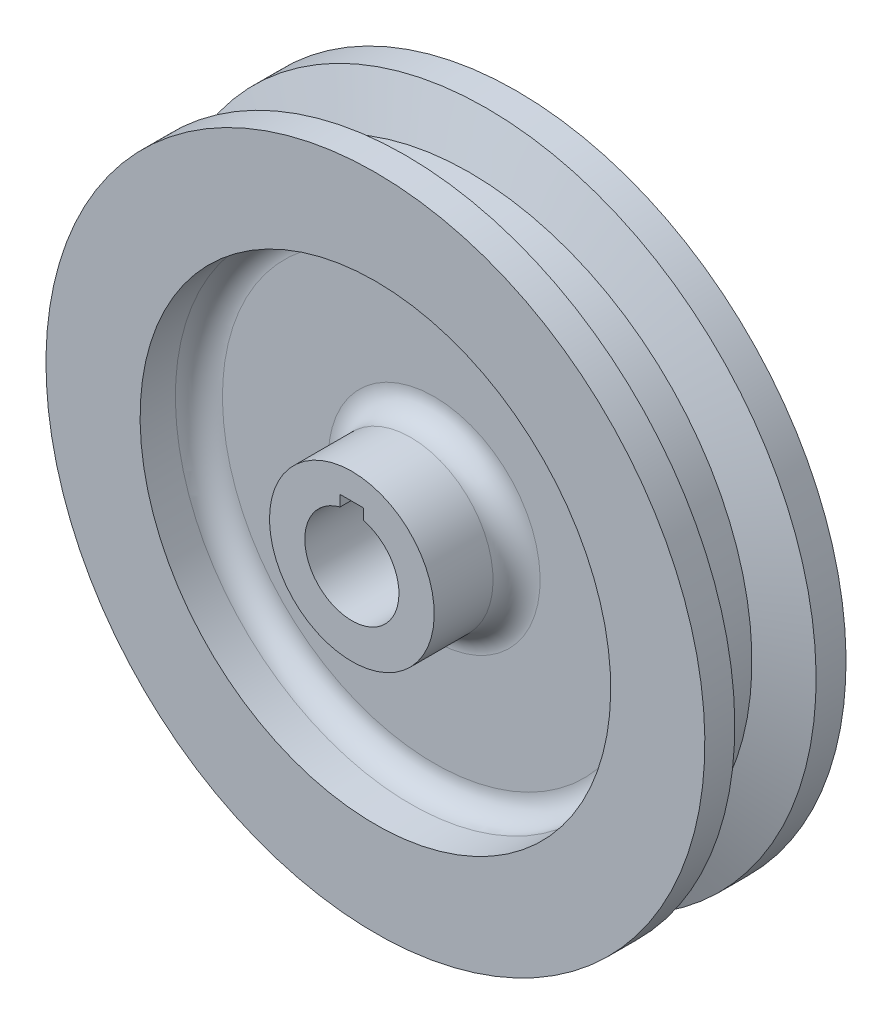
ISO-10303-21;
HEADER;
FILE_DESCRIPTION(('STEP AP214'),'2;1');
FILE_NAME('part.step','',(''),(''),'','','');
FILE_SCHEMA(('AUTOMOTIVE_DESIGN { 1 0 10303 214 1 1 1 1 }'));
ENDSEC;
DATA;
#1=APPLICATION_CONTEXT('core data for automotive mechanical design processes');
#2=APPLICATION_PROTOCOL_DEFINITION('international standard','automotive_design',2000,#1);
#3=PRODUCT_CONTEXT('',#1,'mechanical');
#4=PRODUCT('Part','Part','',(#3));
#5=PRODUCT_RELATED_PRODUCT_CATEGORY('part','',(#4));
#6=PRODUCT_DEFINITION_FORMATION('','',#4);
#7=PRODUCT_DEFINITION_CONTEXT('part definition',#1,'design');
#8=PRODUCT_DEFINITION('design','',#6,#7);
#9=PRODUCT_DEFINITION_SHAPE('','',#8);
#10=(LENGTH_UNIT() NAMED_UNIT(*) SI_UNIT(.MILLI.,.METRE.));
#11=(NAMED_UNIT(*) PLANE_ANGLE_UNIT() SI_UNIT($,.RADIAN.));
#12=(NAMED_UNIT(*) SI_UNIT($,.STERADIAN.) SOLID_ANGLE_UNIT());
#13=UNCERTAINTY_MEASURE_WITH_UNIT(LENGTH_MEASURE(1.E-05),#10,'distance_accuracy_value','');
#14=(GEOMETRIC_REPRESENTATION_CONTEXT(3) GLOBAL_UNCERTAINTY_ASSIGNED_CONTEXT((#13)) GLOBAL_UNIT_ASSIGNED_CONTEXT((#10,
#11,#12)) REPRESENTATION_CONTEXT('',''));
#15=CARTESIAN_POINT('',(0.,0.,0.));
#16=DIRECTION('',(0.,0.,1.));
#17=DIRECTION('',(1.,0.,0.));
#18=AXIS2_PLACEMENT_3D('',#15,#16,#17);
#19=CARTESIAN_POINT('',(0.,22.225,-25.4));
#20=DIRECTION('',(0.,0.,-1.));
#21=DIRECTION('',(0.,1.,0.));
#22=AXIS2_PLACEMENT_3D('',#19,#20,#21);
#23=PLANE('',#22);
#24=DIRECTION('',(0.,-1.,0.));
#25=VECTOR('',#24,1.);
#26=CARTESIAN_POINT('',(-3.175,15.24,-25.4));
#27=LINE('',#26,#25);
#28=CARTESIAN_POINT('',(-3.175,15.24,-25.4));
#29=VERTEX_POINT('',#28);
#30=CARTESIAN_POINT('',(-3.175,12.2967221242086,-25.4));
#31=VERTEX_POINT('',#30);
#32=EDGE_CURVE('E104',#29,#31,#27,.T.);
#33=ORIENTED_EDGE('',*,*,#32,.T.);
#34=CARTESIAN_POINT('',(0.,0.,-25.4));
#35=DIRECTION('',(0.,0.,-1.));
#36=DIRECTION('',(0.,1.,0.));
#37=AXIS2_PLACEMENT_3D('',#34,#35,#36);
#38=CIRCLE('',#37,12.7);
#39=CARTESIAN_POINT('',(3.175,12.2967221242086,-25.4));
#40=VERTEX_POINT('',#39);
#41=EDGE_CURVE('E55',#40,#31,#38,.T.);
#42=ORIENTED_EDGE('',*,*,#41,.F.);
#43=DIRECTION('',(0.,1.,0.));
#44=VECTOR('',#43,1.);
#45=CARTESIAN_POINT('',(3.175,15.24,-25.4));
#46=LINE('',#45,#44);
#47=CARTESIAN_POINT('',(3.175,15.24,-25.4));
#48=VERTEX_POINT('',#47);
#49=EDGE_CURVE('E90',#40,#48,#46,.T.);
#50=ORIENTED_EDGE('',*,*,#49,.T.);
#51=DIRECTION('',(-1.,0.,0.));
#52=VECTOR('',#51,1.);
#53=CARTESIAN_POINT('',(-3.175,15.24,-25.4));
#54=LINE('',#53,#52);
#55=EDGE_CURVE('E95',#48,#29,#54,.T.);
#56=ORIENTED_EDGE('',*,*,#55,.T.);
#57=EDGE_LOOP('',(#33,#42,#50,#56));
#58=FACE_BOUND('',#57,.T.);
#59=CARTESIAN_POINT('',(0.,0.,-25.4));
#60=DIRECTION('',(0.,0.,-1.));
#61=DIRECTION('',(0.,1.,0.));
#62=AXIS2_PLACEMENT_3D('',#59,#60,#61);
#63=CIRCLE('',#62,22.225);
#64=CARTESIAN_POINT('',(0.,22.225,-25.4));
#65=VERTEX_POINT('',#64);
#66=EDGE_CURVE('E115',#65,#65,#63,.T.);
#67=ORIENTED_EDGE('',*,*,#66,.T.);
#68=EDGE_LOOP('',(#67));
#69=FACE_BOUND('',#68,.T.);
#70=ADVANCED_FACE('F48',(#58,#69),#23,.T.);
#71=CARTESIAN_POINT('',(0.,0.,0.));
#72=DIRECTION('',(0.,0.,-1.));
#73=DIRECTION('',(0.,1.,0.));
#74=AXIS2_PLACEMENT_3D('',#71,#72,#73);
#75=CYLINDRICAL_SURFACE('',#74,12.7);
#76=DIRECTION('',(0.,0.,-1.));
#77=VECTOR('',#76,1.);
#78=CARTESIAN_POINT('',(-3.175,12.2967221242086,0.));
#79=LINE('',#78,#77);
#80=CARTESIAN_POINT('',(-3.175,12.2967221242086,25.4));
#81=VERTEX_POINT('',#80);
#82=EDGE_CURVE('E69',#81,#31,#79,.T.);
#83=ORIENTED_EDGE('',*,*,#82,.F.);
#84=CARTESIAN_POINT('',(0.,0.,25.4));
#85=DIRECTION('',(0.,0.,-1.));
#86=DIRECTION('',(0.,1.,0.));
#87=AXIS2_PLACEMENT_3D('',#84,#85,#86);
#88=CIRCLE('',#87,12.7);
#89=CARTESIAN_POINT('',(3.175,12.2967221242086,25.4));
#90=VERTEX_POINT('',#89);
#91=EDGE_CURVE('E169',#90,#81,#88,.T.);
#92=ORIENTED_EDGE('',*,*,#91,.F.);
#93=DIRECTION('',(0.,0.,-1.));
#94=VECTOR('',#93,1.);
#95=CARTESIAN_POINT('',(3.175,12.2967221242086,0.));
#96=LINE('',#95,#94);
#97=EDGE_CURVE('E61',#40,#90,#96,.F.);
#98=ORIENTED_EDGE('',*,*,#97,.F.);
#99=ORIENTED_EDGE('',*,*,#41,.T.);
#100=EDGE_LOOP('',(#83,#92,#98,#99));
#101=FACE_BOUND('',#100,.T.);
#102=ADVANCED_FACE('F172',(#101),#75,.F.);
#103=CARTESIAN_POINT('',(0.,22.225,25.4));
#104=DIRECTION('',(0.,0.,1.));
#105=DIRECTION('',(0.,-1.,0.));
#106=AXIS2_PLACEMENT_3D('',#103,#104,#105);
#107=PLANE('',#106);
#108=DIRECTION('',(0.,-1.,0.));
#109=VECTOR('',#108,1.);
#110=CARTESIAN_POINT('',(-3.175,15.24,25.4));
#111=LINE('',#110,#109);
#112=CARTESIAN_POINT('',(-3.175,15.24,25.4));
#113=VERTEX_POINT('',#112);
#114=EDGE_CURVE('E109',#113,#81,#111,.T.);
#115=ORIENTED_EDGE('',*,*,#114,.F.);
#116=DIRECTION('',(-1.,0.,0.));
#117=VECTOR('',#116,1.);
#118=CARTESIAN_POINT('',(-3.175,15.24,25.4));
#119=LINE('',#118,#117);
#120=CARTESIAN_POINT('',(3.175,15.24,25.4));
#121=VERTEX_POINT('',#120);
#122=EDGE_CURVE('E106',#121,#113,#119,.T.);
#123=ORIENTED_EDGE('',*,*,#122,.F.);
#124=DIRECTION('',(0.,1.,0.));
#125=VECTOR('',#124,1.);
#126=CARTESIAN_POINT('',(3.175,22.225,25.4));
#127=LINE('',#126,#125);
#128=EDGE_CURVE('E13',#90,#121,#127,.T.);
#129=ORIENTED_EDGE('',*,*,#128,.F.);
#130=ORIENTED_EDGE('',*,*,#91,.T.);
#131=EDGE_LOOP('',(#115,#123,#129,#130));
#132=FACE_BOUND('',#131,.T.);
#133=CARTESIAN_POINT('',(0.,0.,25.4));
#134=DIRECTION('',(0.,0.,-1.));
#135=DIRECTION('',(0.,1.,0.));
#136=AXIS2_PLACEMENT_3D('',#133,#134,#135);
#137=CIRCLE('',#136,22.225);
#138=CARTESIAN_POINT('',(0.,22.225,25.4));
#139=VERTEX_POINT('',#138);
#140=EDGE_CURVE('E166',#139,#139,#137,.T.);
#141=ORIENTED_EDGE('',*,*,#140,.F.);
#142=EDGE_LOOP('',(#141));
#143=FACE_BOUND('',#142,.T.);
#144=ADVANCED_FACE('F176',(#132,#143),#107,.T.);
#145=CARTESIAN_POINT('',(0.,0.,0.));
#146=DIRECTION('',(0.,0.,-1.));
#147=DIRECTION('',(0.,1.,0.));
#148=AXIS2_PLACEMENT_3D('',#145,#146,#147);
#149=CYLINDRICAL_SURFACE('',#148,22.225);
#150=ORIENTED_EDGE('',*,*,#140,.T.);
#151=EDGE_LOOP('',(#150));
#152=FACE_BOUND('',#151,.T.);
#153=CARTESIAN_POINT('',(0.,0.,9.52500000000004));
#154=DIRECTION('',(0.,0.,-1.));
#155=DIRECTION('',(0.,1.,0.));
#156=AXIS2_PLACEMENT_3D('',#153,#154,#155);
#157=CIRCLE('',#156,22.225);
#158=CARTESIAN_POINT('',(0.,22.225,9.52500000000004));
#159=VERTEX_POINT('',#158);
#160=EDGE_CURVE('E163',#159,#159,#157,.T.);
#161=ORIENTED_EDGE('',*,*,#160,.F.);
#162=EDGE_LOOP('',(#161));
#163=FACE_BOUND('',#162,.T.);
#164=ADVANCED_FACE('F198',(#152,#163),#149,.T.);
#165=CARTESIAN_POINT('',(0.,0.,9.525));
#166=DIRECTION('',(0.,0.,-1.));
#167=DIRECTION('',(0.,1.,0.));
#168=AXIS2_PLACEMENT_3D('',#165,#166,#167);
#169=TOROIDAL_SURFACE('',#168,28.575,6.35);
#170=ORIENTED_EDGE('',*,*,#160,.T.);
#171=EDGE_LOOP('',(#170));
#172=FACE_BOUND('',#171,.T.);
#173=CARTESIAN_POINT('',(0.,0.,3.175));
#174=DIRECTION('',(0.,0.,-1.));
#175=DIRECTION('',(0.,1.,0.));
#176=AXIS2_PLACEMENT_3D('',#173,#174,#175);
#177=CIRCLE('',#176,28.575);
#178=CARTESIAN_POINT('',(0.,28.575,3.175));
#179=VERTEX_POINT('',#178);
#180=EDGE_CURVE('E160',#179,#179,#177,.T.);
#181=ORIENTED_EDGE('',*,*,#180,.F.);
#182=EDGE_LOOP('',(#181));
#183=FACE_BOUND('',#182,.T.);
#184=ADVANCED_FACE('F203',(#172,#183),#169,.F.);
#185=CARTESIAN_POINT('',(0.,57.15,3.175));
#186=DIRECTION('',(0.,0.,1.));
#187=DIRECTION('',(0.,-1.,0.));
#188=AXIS2_PLACEMENT_3D('',#185,#186,#187);
#189=PLANE('',#188);
#190=ORIENTED_EDGE('',*,*,#180,.T.);
#191=EDGE_LOOP('',(#190));
#192=FACE_BOUND('',#191,.T.);
#193=CARTESIAN_POINT('',(0.,0.,3.17499999999999));
#194=DIRECTION('',(0.,0.,-1.));
#195=DIRECTION('',(0.,1.,0.));
#196=AXIS2_PLACEMENT_3D('',#193,#194,#195);
#197=CIRCLE('',#196,57.15);
#198=CARTESIAN_POINT('',(0.,57.15,3.175));
#199=VERTEX_POINT('',#198);
#200=EDGE_CURVE('E157',#199,#199,#197,.T.);
#201=ORIENTED_EDGE('',*,*,#200,.F.);
#202=EDGE_LOOP('',(#201));
#203=FACE_BOUND('',#202,.T.);
#204=ADVANCED_FACE('F207',(#192,#203),#189,.T.);
#205=CARTESIAN_POINT('',(0.,0.,9.52499999999999));
#206=DIRECTION('',(0.,0.,-1.));
#207=DIRECTION('',(0.,1.,0.));
#208=AXIS2_PLACEMENT_3D('',#205,#206,#207);
#209=TOROIDAL_SURFACE('',#208,57.15,6.35);
#210=ORIENTED_EDGE('',*,*,#200,.T.);
#211=EDGE_LOOP('',(#210));
#212=FACE_BOUND('',#211,.T.);
#213=CARTESIAN_POINT('',(0.,0.,9.52500000000004));
#214=DIRECTION('',(0.,0.,-1.));
#215=DIRECTION('',(0.,1.,0.));
#216=AXIS2_PLACEMENT_3D('',#213,#214,#215);
#217=CIRCLE('',#216,63.5);
#218=CARTESIAN_POINT('',(0.,63.5,9.52500000000004));
#219=VERTEX_POINT('',#218);
#220=EDGE_CURVE('E154',#219,#219,#217,.T.);
#221=ORIENTED_EDGE('',*,*,#220,.F.);
#222=EDGE_LOOP('',(#221));
#223=FACE_BOUND('',#222,.T.);
#224=ADVANCED_FACE('F211',(#212,#223),#209,.F.);
#225=CARTESIAN_POINT('',(0.,0.,0.));
#226=DIRECTION('',(0.,0.,-1.));
#227=DIRECTION('',(0.,1.,0.));
#228=AXIS2_PLACEMENT_3D('',#225,#226,#227);
#229=CYLINDRICAL_SURFACE('',#228,63.5);
#230=ORIENTED_EDGE('',*,*,#220,.T.);
#231=EDGE_LOOP('',(#230));
#232=FACE_BOUND('',#231,.T.);
#233=CARTESIAN_POINT('',(0.,0.,19.05));
#234=DIRECTION('',(0.,0.,-1.));
#235=DIRECTION('',(0.,1.,0.));
#236=AXIS2_PLACEMENT_3D('',#233,#234,#235);
#237=CIRCLE('',#236,63.5);
#238=CARTESIAN_POINT('',(0.,63.5,19.05));
#239=VERTEX_POINT('',#238);
#240=EDGE_CURVE('E151',#239,#239,#237,.T.);
#241=ORIENTED_EDGE('',*,*,#240,.F.);
#242=EDGE_LOOP('',(#241));
#243=FACE_BOUND('',#242,.T.);
#244=ADVANCED_FACE('F215',(#232,#243),#229,.F.);
#245=CARTESIAN_POINT('',(0.,88.9,19.05));
#246=DIRECTION('',(0.,0.,1.));
#247=DIRECTION('',(0.,-1.,0.));
#248=AXIS2_PLACEMENT_3D('',#245,#246,#247);
#249=PLANE('',#248);
#250=ORIENTED_EDGE('',*,*,#240,.T.);
#251=EDGE_LOOP('',(#250));
#252=FACE_BOUND('',#251,.T.);
#253=CARTESIAN_POINT('',(0.,0.,19.05));
#254=DIRECTION('',(0.,0.,-1.));
#255=DIRECTION('',(0.,1.,0.));
#256=AXIS2_PLACEMENT_3D('',#253,#254,#255);
#257=CIRCLE('',#256,88.9);
#258=CARTESIAN_POINT('',(0.,88.9,19.05));
#259=VERTEX_POINT('',#258);
#260=EDGE_CURVE('E148',#259,#259,#257,.T.);
#261=ORIENTED_EDGE('',*,*,#260,.F.);
#262=EDGE_LOOP('',(#261));
#263=FACE_BOUND('',#262,.T.);
#264=ADVANCED_FACE('F219',(#252,#263),#249,.T.);
#265=CARTESIAN_POINT('',(0.,0.,0.));
#266=DIRECTION('',(0.,0.,-1.));
#267=DIRECTION('',(0.,1.,0.));
#268=AXIS2_PLACEMENT_3D('',#265,#266,#267);
#269=CYLINDRICAL_SURFACE('',#268,88.9);
#270=ORIENTED_EDGE('',*,*,#260,.T.);
#271=EDGE_LOOP('',(#270));
#272=FACE_BOUND('',#271,.T.);
#273=CARTESIAN_POINT('',(0.,0.,10.9724219751807));
#274=DIRECTION('',(0.,0.,-1.));
#275=DIRECTION('',(0.,1.,0.));
#276=AXIS2_PLACEMENT_3D('',#273,#274,#275);
#277=CIRCLE('',#276,88.9);
#278=CARTESIAN_POINT('',(0.,88.9,10.9724219751807));
#279=VERTEX_POINT('',#278);
#280=EDGE_CURVE('E145',#279,#279,#277,.T.);
#281=ORIENTED_EDGE('',*,*,#280,.F.);
#282=EDGE_LOOP('',(#281));
#283=FACE_BOUND('',#282,.T.);
#284=ADVANCED_FACE('F223',(#272,#283),#269,.T.);
#285=CARTESIAN_POINT('',(0.,0.,6.34999999999999));
#286=DIRECTION('',(0.,0.,1.));
#287=DIRECTION('',(0.,-1.,0.));
#288=AXIS2_PLACEMENT_3D('',#285,#286,#287);
#289=CONICAL_SURFACE('',#288,76.2,1.22173047639603);
#290=ORIENTED_EDGE('',*,*,#280,.T.);
#291=EDGE_LOOP('',(#290));
#292=FACE_BOUND('',#291,.T.);
#293=CARTESIAN_POINT('',(0.,0.,6.34999999999999));
#294=DIRECTION('',(0.,0.,-1.));
#295=DIRECTION('',(0.,1.,0.));
#296=AXIS2_PLACEMENT_3D('',#293,#294,#295);
#297=CIRCLE('',#296,76.2);
#298=CARTESIAN_POINT('',(0.,76.2,6.35));
#299=VERTEX_POINT('',#298);
#300=EDGE_CURVE('E142',#299,#299,#297,.T.);
#301=ORIENTED_EDGE('',*,*,#300,.F.);
#302=EDGE_LOOP('',(#301));
#303=FACE_BOUND('',#302,.T.);
#304=ADVANCED_FACE('F227',(#292,#303),#289,.T.);
#305=CARTESIAN_POINT('',(0.,0.,0.));
#306=DIRECTION('',(0.,0.,-1.));
#307=DIRECTION('',(0.,1.,0.));
#308=AXIS2_PLACEMENT_3D('',#305,#306,#307);
#309=CYLINDRICAL_SURFACE('',#308,76.2);
#310=ORIENTED_EDGE('',*,*,#300,.T.);
#311=EDGE_LOOP('',(#310));
#312=FACE_BOUND('',#311,.T.);
#313=CARTESIAN_POINT('',(0.,0.,-6.35000000000001));
#314=DIRECTION('',(0.,0.,-1.));
#315=DIRECTION('',(0.,1.,0.));
#316=AXIS2_PLACEMENT_3D('',#313,#314,#315);
#317=CIRCLE('',#316,76.2);
#318=CARTESIAN_POINT('',(0.,76.2,-6.35));
#319=VERTEX_POINT('',#318);
#320=EDGE_CURVE('E139',#319,#319,#317,.T.);
#321=ORIENTED_EDGE('',*,*,#320,.F.);
#322=EDGE_LOOP('',(#321));
#323=FACE_BOUND('',#322,.T.);
#324=ADVANCED_FACE('F231',(#312,#323),#309,.T.);
#325=CARTESIAN_POINT('',(0.,0.,-10.9724219751807));
#326=DIRECTION('',(0.,0.,-1.));
#327=DIRECTION('',(0.,1.,0.));
#328=AXIS2_PLACEMENT_3D('',#325,#326,#327);
#329=CONICAL_SURFACE('',#328,88.9,1.22173047639603);
#330=ORIENTED_EDGE('',*,*,#320,.T.);
#331=EDGE_LOOP('',(#330));
#332=FACE_BOUND('',#331,.T.);
#333=CARTESIAN_POINT('',(0.,0.,-10.9724219751807));
#334=DIRECTION('',(0.,0.,-1.));
#335=DIRECTION('',(0.,1.,0.));
#336=AXIS2_PLACEMENT_3D('',#333,#334,#335);
#337=CIRCLE('',#336,88.9);
#338=CARTESIAN_POINT('',(0.,88.9,-10.9724219751807));
#339=VERTEX_POINT('',#338);
#340=EDGE_CURVE('E136',#339,#339,#337,.T.);
#341=ORIENTED_EDGE('',*,*,#340,.F.);
#342=EDGE_LOOP('',(#341));
#343=FACE_BOUND('',#342,.T.);
#344=ADVANCED_FACE('F235',(#332,#343),#329,.T.);
#345=CARTESIAN_POINT('',(0.,0.,0.));
#346=DIRECTION('',(0.,0.,-1.));
#347=DIRECTION('',(0.,1.,0.));
#348=AXIS2_PLACEMENT_3D('',#345,#346,#347);
#349=CYLINDRICAL_SURFACE('',#348,88.9);
#350=ORIENTED_EDGE('',*,*,#340,.T.);
#351=EDGE_LOOP('',(#350));
#352=FACE_BOUND('',#351,.T.);
#353=CARTESIAN_POINT('',(0.,0.,-19.05));
#354=DIRECTION('',(0.,0.,-1.));
#355=DIRECTION('',(0.,1.,0.));
#356=AXIS2_PLACEMENT_3D('',#353,#354,#355);
#357=CIRCLE('',#356,88.9);
#358=CARTESIAN_POINT('',(0.,88.9,-19.05));
#359=VERTEX_POINT('',#358);
#360=EDGE_CURVE('E133',#359,#359,#357,.T.);
#361=ORIENTED_EDGE('',*,*,#360,.F.);
#362=EDGE_LOOP('',(#361));
#363=FACE_BOUND('',#362,.T.);
#364=ADVANCED_FACE('F239',(#352,#363),#349,.T.);
#365=CARTESIAN_POINT('',(0.,88.9,-19.05));
#366=DIRECTION('',(0.,0.,-1.));
#367=DIRECTION('',(0.,1.,0.));
#368=AXIS2_PLACEMENT_3D('',#365,#366,#367);
#369=PLANE('',#368);
#370=ORIENTED_EDGE('',*,*,#360,.T.);
#371=EDGE_LOOP('',(#370));
#372=FACE_BOUND('',#371,.T.);
#373=CARTESIAN_POINT('',(0.,0.,-19.05));
#374=DIRECTION('',(0.,0.,-1.));
#375=DIRECTION('',(0.,1.,0.));
#376=AXIS2_PLACEMENT_3D('',#373,#374,#375);
#377=CIRCLE('',#376,63.5);
#378=CARTESIAN_POINT('',(0.,63.5,-19.05));
#379=VERTEX_POINT('',#378);
#380=EDGE_CURVE('E130',#379,#379,#377,.T.);
#381=ORIENTED_EDGE('',*,*,#380,.F.);
#382=EDGE_LOOP('',(#381));
#383=FACE_BOUND('',#382,.T.);
#384=ADVANCED_FACE('F243',(#372,#383),#369,.T.);
#385=CARTESIAN_POINT('',(0.,0.,0.));
#386=DIRECTION('',(0.,0.,-1.));
#387=DIRECTION('',(0.,1.,0.));
#388=AXIS2_PLACEMENT_3D('',#385,#386,#387);
#389=CYLINDRICAL_SURFACE('',#388,63.5);
#390=ORIENTED_EDGE('',*,*,#380,.T.);
#391=EDGE_LOOP('',(#390));
#392=FACE_BOUND('',#391,.T.);
#393=CARTESIAN_POINT('',(0.,0.,-9.52500000000005));
#394=DIRECTION('',(0.,0.,-1.));
#395=DIRECTION('',(0.,1.,0.));
#396=AXIS2_PLACEMENT_3D('',#393,#394,#395);
#397=CIRCLE('',#396,63.5);
#398=CARTESIAN_POINT('',(0.,63.5,-9.52500000000004));
#399=VERTEX_POINT('',#398);
#400=EDGE_CURVE('E127',#399,#399,#397,.T.);
#401=ORIENTED_EDGE('',*,*,#400,.F.);
#402=EDGE_LOOP('',(#401));
#403=FACE_BOUND('',#402,.T.);
#404=ADVANCED_FACE('F247',(#392,#403),#389,.F.);
#405=CARTESIAN_POINT('',(0.,0.,-9.52500000000001));
#406=DIRECTION('',(0.,0.,-1.));
#407=DIRECTION('',(0.,1.,0.));
#408=AXIS2_PLACEMENT_3D('',#405,#406,#407);
#409=TOROIDAL_SURFACE('',#408,57.15,6.35);
#410=ORIENTED_EDGE('',*,*,#400,.T.);
#411=EDGE_LOOP('',(#410));
#412=FACE_BOUND('',#411,.T.);
#413=CARTESIAN_POINT('',(0.,0.,-3.17500000000001));
#414=DIRECTION('',(0.,0.,-1.));
#415=DIRECTION('',(0.,1.,0.));
#416=AXIS2_PLACEMENT_3D('',#413,#414,#415);
#417=CIRCLE('',#416,57.15);
#418=CARTESIAN_POINT('',(0.,57.15,-3.175));
#419=VERTEX_POINT('',#418);
#420=EDGE_CURVE('E124',#419,#419,#417,.T.);
#421=ORIENTED_EDGE('',*,*,#420,.F.);
#422=EDGE_LOOP('',(#421));
#423=FACE_BOUND('',#422,.T.);
#424=ADVANCED_FACE('F251',(#412,#423),#409,.F.);
#425=CARTESIAN_POINT('',(0.,57.15,-3.175));
#426=DIRECTION('',(0.,0.,-1.));
#427=DIRECTION('',(0.,1.,0.));
#428=AXIS2_PLACEMENT_3D('',#425,#426,#427);
#429=PLANE('',#428);
#430=ORIENTED_EDGE('',*,*,#420,.T.);
#431=EDGE_LOOP('',(#430));
#432=FACE_BOUND('',#431,.T.);
#433=CARTESIAN_POINT('',(0.,0.,-3.17500000000001));
#434=DIRECTION('',(0.,0.,-1.));
#435=DIRECTION('',(0.,1.,0.));
#436=AXIS2_PLACEMENT_3D('',#433,#434,#435);
#437=CIRCLE('',#436,28.575);
#438=CARTESIAN_POINT('',(0.,28.575,-3.175));
#439=VERTEX_POINT('',#438);
#440=EDGE_CURVE('E121',#439,#439,#437,.T.);
#441=ORIENTED_EDGE('',*,*,#440,.F.);
#442=EDGE_LOOP('',(#441));
#443=FACE_BOUND('',#442,.T.);
#444=ADVANCED_FACE('F255',(#432,#443),#429,.T.);
#445=CARTESIAN_POINT('',(0.,0.,-9.52500000000001));
#446=DIRECTION('',(0.,0.,-1.));
#447=DIRECTION('',(0.,1.,0.));
#448=AXIS2_PLACEMENT_3D('',#445,#446,#447);
#449=TOROIDAL_SURFACE('',#448,28.575,6.35);
#450=ORIENTED_EDGE('',*,*,#440,.T.);
#451=EDGE_LOOP('',(#450));
#452=FACE_BOUND('',#451,.T.);
#453=CARTESIAN_POINT('',(0.,0.,-9.52500000000006));
#454=DIRECTION('',(0.,0.,-1.));
#455=DIRECTION('',(0.,1.,0.));
#456=AXIS2_PLACEMENT_3D('',#453,#454,#455);
#457=CIRCLE('',#456,22.225);
#458=CARTESIAN_POINT('',(0.,22.225,-9.52500000000005));
#459=VERTEX_POINT('',#458);
#460=EDGE_CURVE('E118',#459,#459,#457,.T.);
#461=ORIENTED_EDGE('',*,*,#460,.F.);
#462=EDGE_LOOP('',(#461));
#463=FACE_BOUND('',#462,.T.);
#464=ADVANCED_FACE('F187',(#452,#463),#449,.F.);
#465=CARTESIAN_POINT('',(0.,0.,0.));
#466=DIRECTION('',(0.,0.,-1.));
#467=DIRECTION('',(0.,1.,0.));
#468=AXIS2_PLACEMENT_3D('',#465,#466,#467);
#469=CYLINDRICAL_SURFACE('',#468,22.225);
#470=ORIENTED_EDGE('',*,*,#460,.T.);
#471=EDGE_LOOP('',(#470));
#472=FACE_BOUND('',#471,.T.);
#473=ORIENTED_EDGE('',*,*,#66,.F.);
#474=EDGE_LOOP('',(#473));
#475=FACE_BOUND('',#474,.T.);
#476=ADVANCED_FACE('F180',(#472,#475),#469,.T.);
#477=CARTESIAN_POINT('',(-3.175,15.24,-25.4));
#478=DIRECTION('',(-1.,0.,0.));
#479=DIRECTION('',(0.,-1.,0.));
#480=AXIS2_PLACEMENT_3D('',#477,#478,#479);
#481=PLANE('',#480);
#482=ORIENTED_EDGE('',*,*,#82,.T.);
#483=ORIENTED_EDGE('',*,*,#32,.F.);
#484=DIRECTION('',(0.,0.,1.));
#485=VECTOR('',#484,1.);
#486=CARTESIAN_POINT('',(-3.175,15.24,-25.4));
#487=LINE('',#486,#485);
#488=EDGE_CURVE('E94',#29,#113,#487,.T.);
#489=ORIENTED_EDGE('',*,*,#488,.T.);
#490=ORIENTED_EDGE('',*,*,#114,.T.);
#491=EDGE_LOOP('',(#482,#483,#489,#490));
#492=FACE_BOUND('',#491,.T.);
#493=ADVANCED_FACE('F178',(#492),#481,.F.);
#494=CARTESIAN_POINT('',(-3.175,15.24,-25.4));
#495=DIRECTION('',(0.,1.,0.));
#496=DIRECTION('',(0.,0.,1.));
#497=AXIS2_PLACEMENT_3D('',#494,#495,#496);
#498=PLANE('',#497);
#499=ORIENTED_EDGE('',*,*,#122,.T.);
#500=ORIENTED_EDGE('',*,*,#488,.F.);
#501=ORIENTED_EDGE('',*,*,#55,.F.);
#502=DIRECTION('',(0.,0.,1.));
#503=VECTOR('',#502,1.);
#504=CARTESIAN_POINT('',(3.175,15.24,-25.4));
#505=LINE('',#504,#503);
#506=EDGE_CURVE('E86',#48,#121,#505,.T.);
#507=ORIENTED_EDGE('',*,*,#506,.T.);
#508=EDGE_LOOP('',(#499,#500,#501,#507));
#509=FACE_BOUND('',#508,.T.);
#510=ADVANCED_FACE('F98',(#509),#498,.F.);
#511=CARTESIAN_POINT('',(3.175,15.24,-25.4));
#512=DIRECTION('',(1.,0.,0.));
#513=DIRECTION('',(0.,1.,0.));
#514=AXIS2_PLACEMENT_3D('',#511,#512,#513);
#515=PLANE('',#514);
#516=ORIENTED_EDGE('',*,*,#97,.T.);
#517=ORIENTED_EDGE('',*,*,#128,.T.);
#518=ORIENTED_EDGE('',*,*,#506,.F.);
#519=ORIENTED_EDGE('',*,*,#49,.F.);
#520=EDGE_LOOP('',(#516,#517,#518,#519));
#521=FACE_BOUND('',#520,.T.);
#522=ADVANCED_FACE('F88',(#521),#515,.F.);
#523=CLOSED_SHELL('',(#70,#102,#144,#164,#184,#204,#224,#244,#264,#284,#304,#324,#344,#364,#384,
#404,#424,#444,#464,#476,#493,#510,#522));
#524=MANIFOLD_SOLID_BREP('B2',#523);
#525=ADVANCED_BREP_SHAPE_REPRESENTATION('',(#18,#524),#14);
#526=SHAPE_DEFINITION_REPRESENTATION(#9,#525);
ENDSEC;
END-ISO-10303-21;
